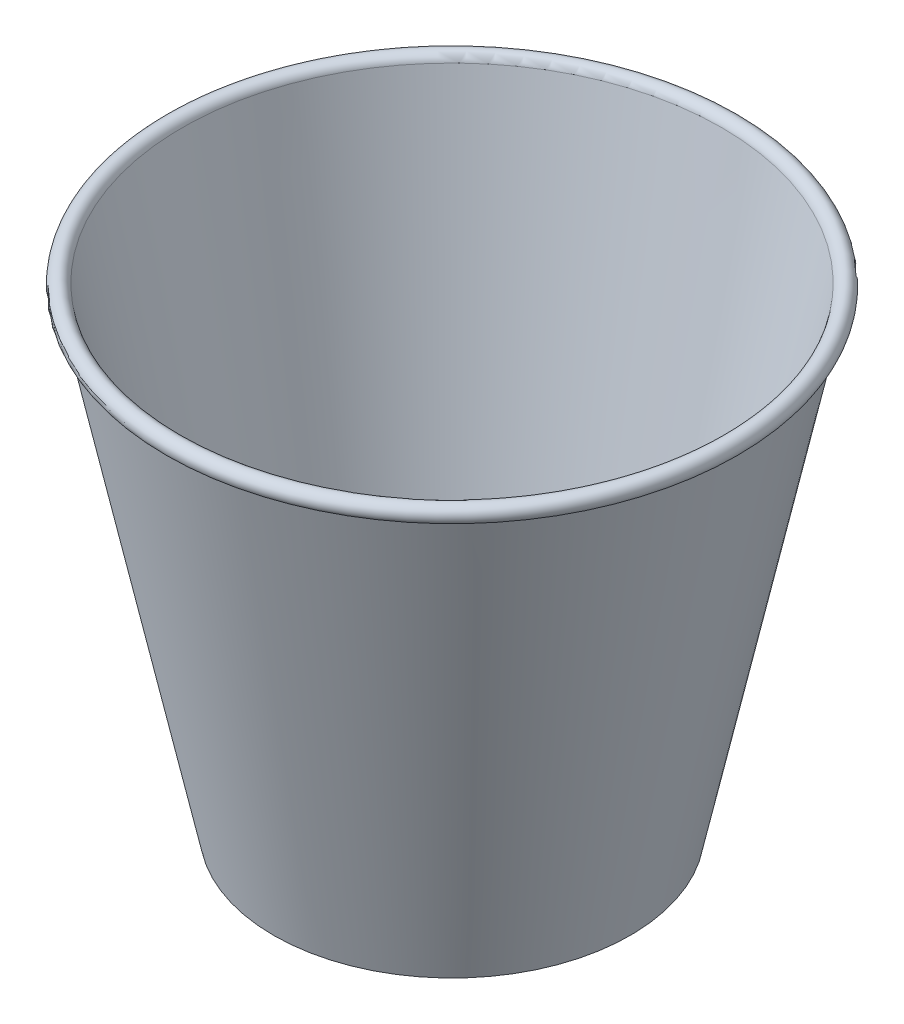
ISO-10303-21;
HEADER;
FILE_DESCRIPTION(('STEP AP214'),'2;1');
FILE_NAME('part.step','',(''),(''),'','','');
FILE_SCHEMA(('AUTOMOTIVE_DESIGN { 1 0 10303 214 1 1 1 1 }'));
ENDSEC;
DATA;
#1=APPLICATION_CONTEXT('core data for automotive mechanical design processes');
#2=APPLICATION_PROTOCOL_DEFINITION('international standard','automotive_design',2000,#1);
#3=PRODUCT_CONTEXT('',#1,'mechanical');
#4=PRODUCT('Part','Part','',(#3));
#5=PRODUCT_RELATED_PRODUCT_CATEGORY('part','',(#4));
#6=PRODUCT_DEFINITION_FORMATION('','',#4);
#7=PRODUCT_DEFINITION_CONTEXT('part definition',#1,'design');
#8=PRODUCT_DEFINITION('design','',#6,#7);
#9=PRODUCT_DEFINITION_SHAPE('','',#8);
#10=(LENGTH_UNIT() NAMED_UNIT(*) SI_UNIT(.MILLI.,.METRE.));
#11=(NAMED_UNIT(*) PLANE_ANGLE_UNIT() SI_UNIT($,.RADIAN.));
#12=(NAMED_UNIT(*) SI_UNIT($,.STERADIAN.) SOLID_ANGLE_UNIT());
#13=UNCERTAINTY_MEASURE_WITH_UNIT(LENGTH_MEASURE(1.E-05),#10,'distance_accuracy_value','');
#14=(GEOMETRIC_REPRESENTATION_CONTEXT(3) GLOBAL_UNCERTAINTY_ASSIGNED_CONTEXT((#13)) GLOBAL_UNIT_ASSIGNED_CONTEXT((#10,
#11,#12)) REPRESENTATION_CONTEXT('',''));
#15=CARTESIAN_POINT('',(0.,0.,0.));
#16=DIRECTION('',(0.,0.,1.));
#17=DIRECTION('',(1.,0.,0.));
#18=AXIS2_PLACEMENT_3D('',#15,#16,#17);
#19=CARTESIAN_POINT('',(0.,-0.228244762511975,0.));
#20=DIRECTION('',(0.,1.,0.));
#21=DIRECTION('',(0.,0.,1.));
#22=AXIS2_PLACEMENT_3D('',#19,#20,#21);
#23=TOROIDAL_SURFACE('',#22,35.0760596304972,1.1);
#24=CARTESIAN_POINT('',(0.,-0.825182107300452,0.));
#25=DIRECTION('',(0.,1.,0.));
#26=DIRECTION('',(0.,0.,1.));
#27=AXIS2_PLACEMENT_3D('',#24,#25,#26);
#28=CIRCLE('',#27,36.);
#29=CARTESIAN_POINT('',(0.,-0.825182107300452,36.));
#30=VERTEX_POINT('',#29);
#31=EDGE_CURVE('E10',#30,#30,#28,.T.);
#32=ORIENTED_EDGE('',*,*,#31,.T.);
#33=EDGE_LOOP('',(#32));
#34=FACE_BOUND('',#33,.T.);
#35=CARTESIAN_POINT('',(0.,0.,0.));
#36=DIRECTION('',(0.,1.,0.));
#37=DIRECTION('',(0.,0.,1.));
#38=AXIS2_PLACEMENT_3D('',#35,#36,#37);
#39=CIRCLE('',#38,34.);
#40=CARTESIAN_POINT('',(0.,0.,34.));
#41=VERTEX_POINT('',#40);
#42=EDGE_CURVE('E50',#41,#41,#39,.T.);
#43=ORIENTED_EDGE('',*,*,#42,.F.);
#44=EDGE_LOOP('',(#43));
#45=FACE_BOUND('',#44,.T.);
#46=ADVANCED_FACE('F31',(#34,#45),#23,.T.);
#47=CARTESIAN_POINT('',(0.,-0.825182107300452,0.));
#48=DIRECTION('',(0.,1.,0.));
#49=DIRECTION('',(0.,0.,1.));
#50=AXIS2_PLACEMENT_3D('',#47,#48,#49);
#51=CONICAL_SURFACE('',#50,36.,1.09269294393632);
#52=CARTESIAN_POINT('',(0.,-1.37729737477574,0.));
#53=DIRECTION('',(0.,1.,0.));
#54=DIRECTION('',(0.,0.,1.));
#55=AXIS2_PLACEMENT_3D('',#52,#53,#54);
#56=CIRCLE('',#55,34.9345570257303);
#57=CARTESIAN_POINT('',(0.,-1.37729737477574,34.9345570257303));
#58=VERTEX_POINT('',#57);
#59=EDGE_CURVE('E37',#58,#58,#56,.T.);
#60=ORIENTED_EDGE('',*,*,#59,.T.);
#61=EDGE_LOOP('',(#60));
#62=FACE_BOUND('',#61,.T.);
#63=ORIENTED_EDGE('',*,*,#31,.F.);
#64=EDGE_LOOP('',(#63));
#65=FACE_BOUND('',#64,.T.);
#66=ADVANCED_FACE('F58',(#62,#65),#51,.T.);
#67=CARTESIAN_POINT('',(0.,-1.37729737477574,0.));
#68=DIRECTION('',(0.,1.,0.));
#69=DIRECTION('',(0.,0.,1.));
#70=AXIS2_PLACEMENT_3D('',#67,#68,#69);
#71=CONICAL_SURFACE('',#70,34.9345570257303,0.209013773529847);
#72=CARTESIAN_POINT('',(0.,-60.0000000000002,0.));
#73=DIRECTION('',(0.,1.,0.));
#74=DIRECTION('',(0.,0.,1.));
#75=AXIS2_PLACEMENT_3D('',#72,#73,#74);
#76=CIRCLE('',#75,22.5);
#77=CARTESIAN_POINT('',(0.,-60.0000000000002,22.5));
#78=VERTEX_POINT('',#77);
#79=EDGE_CURVE('E41',#78,#78,#76,.T.);
#80=ORIENTED_EDGE('',*,*,#79,.T.);
#81=EDGE_LOOP('',(#80));
#82=FACE_BOUND('',#81,.T.);
#83=ORIENTED_EDGE('',*,*,#59,.F.);
#84=EDGE_LOOP('',(#83));
#85=FACE_BOUND('',#84,.T.);
#86=ADVANCED_FACE('F62',(#82,#85),#71,.T.);
#87=CARTESIAN_POINT('',(0.,-565.999999999995,0.));
#88=DIRECTION('',(0.,1.,0.));
#89=DIRECTION('',(0.,0.,1.));
#90=AXIS2_PLACEMENT_3D('',#87,#88,#89);
#91=SPHERICAL_SURFACE('',#90,506.499999999995);
#92=ORIENTED_EDGE('',*,*,#79,.F.);
#93=EDGE_LOOP('',(#92));
#94=FACE_BOUND('',#93,.T.);
#95=ADVANCED_FACE('F66',(#94),#91,.F.);
#96=CARTESIAN_POINT('',(0.,-565.999999999995,0.));
#97=DIRECTION('',(0.,1.,0.));
#98=DIRECTION('',(0.,0.,1.));
#99=AXIS2_PLACEMENT_3D('',#96,#97,#98);
#100=SPHERICAL_SURFACE('',#99,507.999999999995);
#101=CARTESIAN_POINT('',(0.,-58.4594235911785,0.));
#102=DIRECTION('',(0.,1.,0.));
#103=DIRECTION('',(0.,0.,1.));
#104=AXIS2_PLACEMENT_3D('',#101,#102,#103);
#105=CIRCLE('',#104,21.600076356373);
#106=CARTESIAN_POINT('',(0.,-58.4594235911785,21.600076356373));
#107=VERTEX_POINT('',#106);
#108=EDGE_CURVE('E45',#107,#107,#105,.T.);
#109=ORIENTED_EDGE('',*,*,#108,.T.);
#110=EDGE_LOOP('',(#109));
#111=FACE_BOUND('',#110,.T.);
#112=ADVANCED_FACE('F73',(#111),#100,.T.);
#113=CARTESIAN_POINT('',(0.,-58.4594235911785,0.));
#114=DIRECTION('',(0.,1.,0.));
#115=DIRECTION('',(0.,0.,1.));
#116=AXIS2_PLACEMENT_3D('',#113,#114,#115);
#117=CONICAL_SURFACE('',#116,21.600076356373,0.209013773529848);
#118=ORIENTED_EDGE('',*,*,#42,.T.);
#119=EDGE_LOOP('',(#118));
#120=FACE_BOUND('',#119,.T.);
#121=ORIENTED_EDGE('',*,*,#108,.F.);
#122=EDGE_LOOP('',(#121));
#123=FACE_BOUND('',#122,.T.);
#124=ADVANCED_FACE('F54',(#120,#123),#117,.F.);
#125=CLOSED_SHELL('',(#46,#66,#86,#95,#112,#124));
#126=MANIFOLD_SOLID_BREP('B2',#125);
#127=ADVANCED_BREP_SHAPE_REPRESENTATION('',(#18,#126),#14);
#128=SHAPE_DEFINITION_REPRESENTATION(#9,#127);
ENDSEC;
END-ISO-10303-21;
